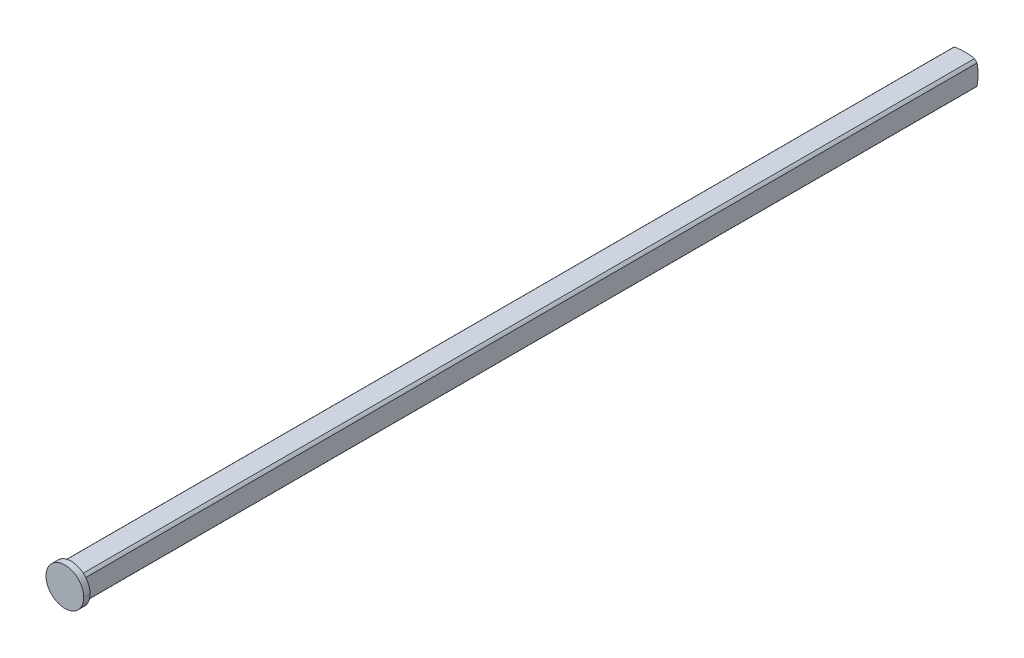
ISO-10303-21;
HEADER;
FILE_DESCRIPTION(('STEP AP214'),'2;1');
FILE_NAME('part.step','',(''),(''),'','','');
FILE_SCHEMA(('AUTOMOTIVE_DESIGN { 1 0 10303 214 1 1 1 1 }'));
ENDSEC;
DATA;
#1=APPLICATION_CONTEXT('core data for automotive mechanical design processes');
#2=APPLICATION_PROTOCOL_DEFINITION('international standard','automotive_design',2000,#1);
#3=PRODUCT_CONTEXT('',#1,'mechanical');
#4=PRODUCT('Part','Part','',(#3));
#5=PRODUCT_RELATED_PRODUCT_CATEGORY('part','',(#4));
#6=PRODUCT_DEFINITION_FORMATION('','',#4);
#7=PRODUCT_DEFINITION_CONTEXT('part definition',#1,'design');
#8=PRODUCT_DEFINITION('design','',#6,#7);
#9=PRODUCT_DEFINITION_SHAPE('','',#8);
#10=(LENGTH_UNIT() NAMED_UNIT(*) SI_UNIT(.MILLI.,.METRE.));
#11=(NAMED_UNIT(*) PLANE_ANGLE_UNIT() SI_UNIT($,.RADIAN.));
#12=(NAMED_UNIT(*) SI_UNIT($,.STERADIAN.) SOLID_ANGLE_UNIT());
#13=UNCERTAINTY_MEASURE_WITH_UNIT(LENGTH_MEASURE(1.E-05),#10,'distance_accuracy_value','');
#14=(GEOMETRIC_REPRESENTATION_CONTEXT(3) GLOBAL_UNCERTAINTY_ASSIGNED_CONTEXT((#13)) GLOBAL_UNIT_ASSIGNED_CONTEXT((#10,
#11,#12)) REPRESENTATION_CONTEXT('',''));
#15=CARTESIAN_POINT('',(0.,0.,0.));
#16=DIRECTION('',(0.,0.,1.));
#17=DIRECTION('',(1.,0.,0.));
#18=AXIS2_PLACEMENT_3D('',#15,#16,#17);
#19=CARTESIAN_POINT('',(0.,0.,-112.522));
#20=DIRECTION('',(0.,0.,1.));
#21=DIRECTION('',(1.,0.,0.));
#22=AXIS2_PLACEMENT_3D('',#19,#20,#21);
#23=CYLINDRICAL_SURFACE('',#22,2.032);
#24=DIRECTION('',(0.,0.,-1.));
#25=VECTOR('',#24,1.);
#26=CARTESIAN_POINT('',(1.5875,1.26841150657032,-112.522));
#27=LINE('',#26,#25);
#28=CARTESIAN_POINT('',(1.5875,1.26841150657032,0.));
#29=VERTEX_POINT('',#28);
#30=CARTESIAN_POINT('',(1.5875,1.26841150657032,-112.370919142098));
#31=VERTEX_POINT('',#30);
#32=EDGE_CURVE('P0_E174',#29,#31,#27,.T.);
#33=ORIENTED_EDGE('',*,*,#32,.T.);
#34=CARTESIAN_POINT('',(0.,0.,-112.370919142098));
#35=DIRECTION('',(0.,0.,1.));
#36=DIRECTION('',(1.,0.,0.));
#37=AXIS2_PLACEMENT_3D('',#34,#35,#36);
#38=CIRCLE('',#37,2.032);
#39=CARTESIAN_POINT('',(1.26841150657032,1.5875,-112.370919142098));
#40=VERTEX_POINT('',#39);
#41=EDGE_CURVE('P0_E294',#31,#40,#38,.T.);
#42=ORIENTED_EDGE('',*,*,#41,.T.);
#43=DIRECTION('',(0.,0.,1.));
#44=VECTOR('',#43,1.);
#45=CARTESIAN_POINT('',(1.26841150657032,1.5875,-112.522));
#46=LINE('',#45,#44);
#47=CARTESIAN_POINT('',(1.26841150657032,1.5875,0.));
#48=VERTEX_POINT('',#47);
#49=EDGE_CURVE('P0_E172',#40,#48,#46,.T.);
#50=ORIENTED_EDGE('',*,*,#49,.T.);
#51=CARTESIAN_POINT('',(0.,0.,0.));
#52=DIRECTION('',(0.,0.,1.));
#53=DIRECTION('',(1.,0.,0.));
#54=AXIS2_PLACEMENT_3D('',#51,#52,#53);
#55=CIRCLE('',#54,2.032);
#56=EDGE_CURVE('P0_E124',#29,#48,#55,.T.);
#57=ORIENTED_EDGE('',*,*,#56,.F.);
#58=EDGE_LOOP('',(#33,#42,#50,#57));
#59=FACE_BOUND('',#58,.T.);
#60=ADVANCED_FACE('P0_F17',(#59),#23,.T.);
#61=CARTESIAN_POINT('',(0.,0.,-112.522));
#62=DIRECTION('',(0.,0.,1.));
#63=DIRECTION('',(1.,0.,0.));
#64=AXIS2_PLACEMENT_3D('',#61,#62,#63);
#65=CYLINDRICAL_SURFACE('',#64,2.032);
#66=DIRECTION('',(0.,0.,1.));
#67=VECTOR('',#66,1.);
#68=CARTESIAN_POINT('',(-1.5875,1.26841150657032,-112.522));
#69=LINE('',#68,#67);
#70=CARTESIAN_POINT('',(-1.5875,1.26841150657032,-112.370919142098));
#71=VERTEX_POINT('',#70);
#72=CARTESIAN_POINT('',(-1.5875,1.26841150657032,0.));
#73=VERTEX_POINT('',#72);
#74=EDGE_CURVE('P0_E277',#71,#73,#69,.T.);
#75=ORIENTED_EDGE('',*,*,#74,.T.);
#76=CARTESIAN_POINT('',(0.,0.,0.));
#77=DIRECTION('',(0.,0.,1.));
#78=DIRECTION('',(1.,0.,0.));
#79=AXIS2_PLACEMENT_3D('',#76,#77,#78);
#80=CIRCLE('',#79,2.032);
#81=CARTESIAN_POINT('',(-1.26841150657032,1.5875,0.));
#82=VERTEX_POINT('',#81);
#83=EDGE_CURVE('P0_E42',#82,#73,#80,.T.);
#84=ORIENTED_EDGE('',*,*,#83,.F.);
#85=DIRECTION('',(0.,0.,-1.));
#86=VECTOR('',#85,1.);
#87=CARTESIAN_POINT('',(-1.26841150657032,1.5875,-112.522));
#88=LINE('',#87,#86);
#89=CARTESIAN_POINT('',(-1.26841150657032,1.5875,-112.370919142098));
#90=VERTEX_POINT('',#89);
#91=EDGE_CURVE('P0_E157',#82,#90,#88,.T.);
#92=ORIENTED_EDGE('',*,*,#91,.T.);
#93=CARTESIAN_POINT('',(0.,0.,-112.370919142098));
#94=DIRECTION('',(0.,0.,1.));
#95=DIRECTION('',(1.,0.,0.));
#96=AXIS2_PLACEMENT_3D('',#93,#94,#95);
#97=CIRCLE('',#96,2.032);
#98=EDGE_CURVE('P0_E258',#90,#71,#97,.T.);
#99=ORIENTED_EDGE('',*,*,#98,.T.);
#100=EDGE_LOOP('',(#75,#84,#92,#99));
#101=FACE_BOUND('',#100,.T.);
#102=ADVANCED_FACE('P0_F197',(#101),#65,.T.);
#103=CARTESIAN_POINT('',(0.,0.,-112.522));
#104=DIRECTION('',(0.,0.,1.));
#105=DIRECTION('',(1.,0.,0.));
#106=AXIS2_PLACEMENT_3D('',#103,#104,#105);
#107=CYLINDRICAL_SURFACE('',#106,2.032);
#108=DIRECTION('',(0.,0.,-1.));
#109=VECTOR('',#108,1.);
#110=CARTESIAN_POINT('',(-1.5875,-1.26841150657032,-112.522));
#111=LINE('',#110,#109);
#112=CARTESIAN_POINT('',(-1.5875,-1.26841150657032,0.));
#113=VERTEX_POINT('',#112);
#114=CARTESIAN_POINT('',(-1.5875,-1.26841150657032,-112.370919142098));
#115=VERTEX_POINT('',#114);
#116=EDGE_CURVE('P0_E290',#113,#115,#111,.T.);
#117=ORIENTED_EDGE('',*,*,#116,.T.);
#118=CARTESIAN_POINT('',(0.,0.,-112.370919142098));
#119=DIRECTION('',(0.,0.,1.));
#120=DIRECTION('',(1.,0.,0.));
#121=AXIS2_PLACEMENT_3D('',#118,#119,#120);
#122=CIRCLE('',#121,2.032);
#123=CARTESIAN_POINT('',(-1.26841150657032,-1.5875,-112.370919142098));
#124=VERTEX_POINT('',#123);
#125=EDGE_CURVE('P0_E11',#115,#124,#122,.T.);
#126=ORIENTED_EDGE('',*,*,#125,.T.);
#127=DIRECTION('',(0.,0.,1.));
#128=VECTOR('',#127,1.);
#129=CARTESIAN_POINT('',(-1.26841150657032,-1.5875,-112.522));
#130=LINE('',#129,#128);
#131=CARTESIAN_POINT('',(-1.26841150657032,-1.5875,0.));
#132=VERTEX_POINT('',#131);
#133=EDGE_CURVE('P0_E399',#124,#132,#130,.T.);
#134=ORIENTED_EDGE('',*,*,#133,.T.);
#135=CARTESIAN_POINT('',(0.,0.,0.));
#136=DIRECTION('',(0.,0.,1.));
#137=DIRECTION('',(1.,0.,0.));
#138=AXIS2_PLACEMENT_3D('',#135,#136,#137);
#139=CIRCLE('',#138,2.032);
#140=EDGE_CURVE('P0_E147',#113,#132,#139,.T.);
#141=ORIENTED_EDGE('',*,*,#140,.F.);
#142=EDGE_LOOP('',(#117,#126,#134,#141));
#143=FACE_BOUND('',#142,.T.);
#144=ADVANCED_FACE('P0_F325',(#143),#107,.T.);
#145=CARTESIAN_POINT('',(0.,0.,-112.522));
#146=DIRECTION('',(0.,0.,1.));
#147=DIRECTION('',(1.,0.,0.));
#148=AXIS2_PLACEMENT_3D('',#145,#146,#147);
#149=CYLINDRICAL_SURFACE('',#148,2.032);
#150=DIRECTION('',(0.,0.,-1.));
#151=VECTOR('',#150,1.);
#152=CARTESIAN_POINT('',(1.26841150657032,-1.5875,-112.522));
#153=LINE('',#152,#151);
#154=CARTESIAN_POINT('',(1.26841150657032,-1.5875,0.));
#155=VERTEX_POINT('',#154);
#156=CARTESIAN_POINT('',(1.26841150657032,-1.5875,-112.370919142098));
#157=VERTEX_POINT('',#156);
#158=EDGE_CURVE('P0_E164',#155,#157,#153,.T.);
#159=ORIENTED_EDGE('',*,*,#158,.T.);
#160=CARTESIAN_POINT('',(0.,0.,-112.370919142098));
#161=DIRECTION('',(0.,0.,1.));
#162=DIRECTION('',(1.,0.,0.));
#163=AXIS2_PLACEMENT_3D('',#160,#161,#162);
#164=CIRCLE('',#163,2.032);
#165=CARTESIAN_POINT('',(1.5875,-1.26841150657032,-112.370919142098));
#166=VERTEX_POINT('',#165);
#167=EDGE_CURVE('P0_E26',#157,#166,#164,.T.);
#168=ORIENTED_EDGE('',*,*,#167,.T.);
#169=DIRECTION('',(0.,0.,1.));
#170=VECTOR('',#169,1.);
#171=CARTESIAN_POINT('',(1.5875,-1.26841150657032,-112.522));
#172=LINE('',#171,#170);
#173=CARTESIAN_POINT('',(1.5875,-1.26841150657032,0.));
#174=VERTEX_POINT('',#173);
#175=EDGE_CURVE('P0_E163',#166,#174,#172,.T.);
#176=ORIENTED_EDGE('',*,*,#175,.T.);
#177=CARTESIAN_POINT('',(0.,0.,0.));
#178=DIRECTION('',(0.,0.,1.));
#179=DIRECTION('',(1.,0.,0.));
#180=AXIS2_PLACEMENT_3D('',#177,#178,#179);
#181=CIRCLE('',#180,2.032);
#182=EDGE_CURVE('P0_E153',#155,#174,#181,.T.);
#183=ORIENTED_EDGE('',*,*,#182,.F.);
#184=EDGE_LOOP('',(#159,#168,#176,#183));
#185=FACE_BOUND('',#184,.T.);
#186=ADVANCED_FACE('P0_F322',(#185),#149,.T.);
#187=CARTESIAN_POINT('',(-1.5875,1.5875,-112.522));
#188=DIRECTION('',(0.,0.,-1.));
#189=DIRECTION('',(0.,-1.,0.));
#190=AXIS2_PLACEMENT_3D('',#187,#188,#189);
#191=PLANE('',#190);
#192=CARTESIAN_POINT('',(0.,0.,-112.522));
#193=DIRECTION('',(0.,0.,1.));
#194=DIRECTION('',(1.,0.,0.));
#195=AXIS2_PLACEMENT_3D('',#192,#193,#194);
#196=CIRCLE('',#195,1.24506403026729);
#197=CARTESIAN_POINT('',(1.24506403026729,0.,-112.522));
#198=VERTEX_POINT('',#197);
#199=CARTESIAN_POINT('',(-1.24506403026729,0.,-112.522));
#200=VERTEX_POINT('',#199);
#201=EDGE_CURVE('P0_E120',#198,#200,#196,.T.);
#202=ORIENTED_EDGE('',*,*,#201,.F.);
#203=CARTESIAN_POINT('',(0.,0.,-112.522));
#204=DIRECTION('',(0.,0.,1.));
#205=DIRECTION('',(1.,0.,0.));
#206=AXIS2_PLACEMENT_3D('',#203,#204,#205);
#207=CIRCLE('',#206,1.24506403026729);
#208=EDGE_CURVE('P0_E116',#200,#198,#207,.T.);
#209=ORIENTED_EDGE('',*,*,#208,.F.);
#210=EDGE_LOOP('',(#202,#209));
#211=FACE_BOUND('',#210,.T.);
#212=ADVANCED_FACE('P0_F119',(#211),#191,.T.);
#213=CARTESIAN_POINT('',(0.,0.,-110.397));
#214=DIRECTION('',(0.,0.,1.));
#215=DIRECTION('',(1.,0.,0.));
#216=AXIS2_PLACEMENT_3D('',#213,#214,#215);
#217=DEGENERATE_TOROIDAL_SURFACE('',#216,1.24506403026729,2.125,.T.);
#218=CARTESIAN_POINT('',(-1.24506403026729,0.,-110.397));
#219=DIRECTION('',(0.,1.,0.));
#220=DIRECTION('',(-1.,0.,0.));
#221=AXIS2_PLACEMENT_3D('',#218,#219,#220);
#222=CIRCLE('',#221,2.125);
#223=CARTESIAN_POINT('',(-1.5875,0.,-112.494227361693));
#224=VERTEX_POINT('',#223);
#225=EDGE_CURVE('P0_E128',#200,#224,#222,.T.);
#226=ORIENTED_EDGE('',*,*,#225,.F.);
#227=ORIENTED_EDGE('',*,*,#208,.T.);
#228=CARTESIAN_POINT('',(1.24506403026729,0.,-110.397));
#229=DIRECTION('',(0.,-1.,0.));
#230=DIRECTION('',(0.,0.,-1.));
#231=AXIS2_PLACEMENT_3D('',#228,#229,#230);
#232=CIRCLE('',#231,2.125);
#233=CARTESIAN_POINT('',(1.5875,0.,-112.494227361693));
#234=VERTEX_POINT('',#233);
#235=EDGE_CURVE('P0_E142',#198,#234,#232,.T.);
#236=ORIENTED_EDGE('',*,*,#235,.T.);
#237=CARTESIAN_POINT('',(1.5875,-1.26841150657032,-112.370919142098));
#238=CARTESIAN_POINT('',(1.5875,-0.98707709495555,-112.440930639124));
#239=CARTESIAN_POINT('',(1.5875,-0.639530459017568,-112.47018195389));
#240=CARTESIAN_POINT('',(1.5875,-0.353837297572158,-112.494227361693));
#241=CARTESIAN_POINT('',(1.5875,0.,-112.494227361693));
#242=B_SPLINE_CURVE_WITH_KNOTS('',2,(#237,#238,#239,#240,#241),.UNSPECIFIED.,.F.,.F.,(3,2,3),
(0.,0.5,1.),.UNSPECIFIED.);
#243=EDGE_CURVE('P0_E177',#166,#234,#242,.T.);
#244=ORIENTED_EDGE('',*,*,#243,.F.);
#245=ORIENTED_EDGE('',*,*,#167,.F.);
#246=CARTESIAN_POINT('',(-1.26841150657032,-1.5875,-112.370919142098));
#247=CARTESIAN_POINT('',(-0.770338232285919,-1.5875,-112.494867205761));
#248=CARTESIAN_POINT('',(0.00849337593367507,-1.5875,-112.49422365179));
#249=CARTESIAN_POINT('',(0.775470990323975,-1.5875,-112.493589892857));
#250=CARTESIAN_POINT('',(1.26841150657033,-1.5875,-112.370919142098));
#251=B_SPLINE_CURVE_WITH_KNOTS('',2,(#246,#247,#248,#249,#250),.UNSPECIFIED.,.F.,.F.,(3,2,3),
(0.,0.5,1.),.UNSPECIFIED.);
#252=EDGE_CURVE('P0_E306',#124,#157,#251,.T.);
#253=ORIENTED_EDGE('',*,*,#252,.F.);
#254=ORIENTED_EDGE('',*,*,#125,.F.);
#255=CARTESIAN_POINT('',(-1.5875,0.,-112.494227361693));
#256=CARTESIAN_POINT('',(-1.5875,-0.35317995732653,-112.494227361693));
#257=CARTESIAN_POINT('',(-1.5875,-0.639529322286498,-112.470182049451));
#258=CARTESIAN_POINT('',(-1.5875,-0.986669843199056,-112.441031985792));
#259=CARTESIAN_POINT('',(-1.5875,-1.26841150657032,-112.370919142098));
#260=B_SPLINE_CURVE_WITH_KNOTS('',2,(#255,#256,#257,#258,#259),.UNSPECIFIED.,.F.,.F.,(3,2,3),
(0.,0.5,1.),.UNSPECIFIED.);
#261=EDGE_CURVE('P0_E135',#224,#115,#260,.T.);
#262=ORIENTED_EDGE('',*,*,#261,.F.);
#263=EDGE_LOOP('',(#226,#227,#236,#244,#245,#253,#254,#262));
#264=FACE_BOUND('',#263,.T.);
#265=ADVANCED_FACE('P0_F127',(#264),#217,.T.);
#266=CARTESIAN_POINT('',(-1.5875,1.5875,0.));
#267=DIRECTION('',(0.,0.,-1.));
#268=DIRECTION('',(0.,-1.,0.));
#269=AXIS2_PLACEMENT_3D('',#266,#267,#268);
#270=PLANE('',#269);
#271=ORIENTED_EDGE('',*,*,#83,.T.);
#272=DIRECTION('',(0.,-1.,0.));
#273=VECTOR('',#272,1.);
#274=CARTESIAN_POINT('',(-1.5875,-1.5875,0.));
#275=LINE('',#274,#273);
#276=EDGE_CURVE('P0_E404',#73,#113,#275,.T.);
#277=ORIENTED_EDGE('',*,*,#276,.T.);
#278=ORIENTED_EDGE('',*,*,#140,.T.);
#279=DIRECTION('',(1.,0.,0.));
#280=VECTOR('',#279,1.);
#281=CARTESIAN_POINT('',(-1.5875,-1.5875,0.));
#282=LINE('',#281,#280);
#283=EDGE_CURVE('P0_E159',#132,#155,#282,.T.);
#284=ORIENTED_EDGE('',*,*,#283,.T.);
#285=ORIENTED_EDGE('',*,*,#182,.T.);
#286=DIRECTION('',(0.,1.,0.));
#287=VECTOR('',#286,1.);
#288=CARTESIAN_POINT('',(1.5875,-1.5875,0.));
#289=LINE('',#288,#287);
#290=EDGE_CURVE('P0_E169',#174,#29,#289,.T.);
#291=ORIENTED_EDGE('',*,*,#290,.T.);
#292=ORIENTED_EDGE('',*,*,#56,.T.);
#293=DIRECTION('',(-1.,0.,0.));
#294=VECTOR('',#293,1.);
#295=CARTESIAN_POINT('',(-1.5875,1.5875,0.));
#296=LINE('',#295,#294);
#297=EDGE_CURVE('P0_E156',#48,#82,#296,.T.);
#298=ORIENTED_EDGE('',*,*,#297,.T.);
#299=EDGE_LOOP('',(#271,#277,#278,#284,#285,#291,#292,#298));
#300=FACE_BOUND('',#299,.T.);
#301=ADVANCED_FACE('P0_F228',(#300),#270,.F.);
#302=CARTESIAN_POINT('',(-1.5875,1.5875,0.));
#303=DIRECTION('',(0.,-1.,0.));
#304=DIRECTION('',(0.,0.,-1.));
#305=AXIS2_PLACEMENT_3D('',#302,#303,#304);
#306=PLANE('',#305);
#307=ORIENTED_EDGE('',*,*,#49,.F.);
#308=CARTESIAN_POINT('',(1.26841150657033,1.5875,-112.370919142098));
#309=CARTESIAN_POINT('',(0.77033823228592,1.5875,-112.494867205761));
#310=CARTESIAN_POINT('',(-0.00849337593367486,1.5875,-112.49422365179));
#311=CARTESIAN_POINT('',(-0.775470990323975,1.5875,-112.493589892857));
#312=CARTESIAN_POINT('',(-1.26841150657032,1.5875,-112.370919142098));
#313=B_SPLINE_CURVE_WITH_KNOTS('',2,(#308,#309,#310,#311,#312),.UNSPECIFIED.,.F.,.F.,(3,2,3),
(0.,0.5,1.),.UNSPECIFIED.);
#314=EDGE_CURVE('P0_E257',#40,#90,#313,.T.);
#315=ORIENTED_EDGE('',*,*,#314,.T.);
#316=ORIENTED_EDGE('',*,*,#91,.F.);
#317=ORIENTED_EDGE('',*,*,#297,.F.);
#318=EDGE_LOOP('',(#307,#315,#316,#317));
#319=FACE_BOUND('',#318,.T.);
#320=ADVANCED_FACE('P0_F198',(#319),#306,.F.);
#321=CARTESIAN_POINT('',(1.5875,-1.5875,0.));
#322=DIRECTION('',(-1.,0.,0.));
#323=DIRECTION('',(0.,0.,1.));
#324=AXIS2_PLACEMENT_3D('',#321,#322,#323);
#325=PLANE('',#324);
#326=ORIENTED_EDGE('',*,*,#175,.F.);
#327=ORIENTED_EDGE('',*,*,#243,.T.);
#328=CARTESIAN_POINT('',(1.5875,0.,-112.494227361693));
#329=CARTESIAN_POINT('',(1.5875,0.353179957326585,-112.494227361693));
#330=CARTESIAN_POINT('',(1.5875,0.6395293222865,-112.470182049451));
#331=CARTESIAN_POINT('',(1.5875,0.98666984319909,-112.441031985792));
#332=CARTESIAN_POINT('',(1.5875,1.26841150657033,-112.370919142098));
#333=B_SPLINE_CURVE_WITH_KNOTS('',2,(#328,#329,#330,#331,#332),.UNSPECIFIED.,.F.,.F.,(3,2,3),
(0.,0.5,1.),.UNSPECIFIED.);
#334=EDGE_CURVE('P0_E212',#234,#31,#333,.T.);
#335=ORIENTED_EDGE('',*,*,#334,.T.);
#336=ORIENTED_EDGE('',*,*,#32,.F.);
#337=ORIENTED_EDGE('',*,*,#290,.F.);
#338=EDGE_LOOP('',(#326,#327,#335,#336,#337));
#339=FACE_BOUND('',#338,.T.);
#340=ADVANCED_FACE('P0_F184',(#339),#325,.F.);
#341=CARTESIAN_POINT('',(-1.5875,-1.5875,0.));
#342=DIRECTION('',(0.,1.,0.));
#343=DIRECTION('',(1.,0.,0.));
#344=AXIS2_PLACEMENT_3D('',#341,#342,#343);
#345=PLANE('',#344);
#346=ORIENTED_EDGE('',*,*,#133,.F.);
#347=ORIENTED_EDGE('',*,*,#252,.T.);
#348=ORIENTED_EDGE('',*,*,#158,.F.);
#349=ORIENTED_EDGE('',*,*,#283,.F.);
#350=EDGE_LOOP('',(#346,#347,#348,#349));
#351=FACE_BOUND('',#350,.T.);
#352=ADVANCED_FACE('P0_F194',(#351),#345,.F.);
#353=CARTESIAN_POINT('',(-1.5875,-1.5875,0.));
#354=DIRECTION('',(1.,0.,0.));
#355=DIRECTION('',(0.,1.,0.));
#356=AXIS2_PLACEMENT_3D('',#353,#354,#355);
#357=PLANE('',#356);
#358=ORIENTED_EDGE('',*,*,#74,.F.);
#359=CARTESIAN_POINT('',(-1.5875,1.26841150657033,-112.370919142098));
#360=CARTESIAN_POINT('',(-1.5875,0.98707709495557,-112.440930639124));
#361=CARTESIAN_POINT('',(-1.5875,0.63953045901757,-112.47018195389));
#362=CARTESIAN_POINT('',(-1.5875,0.353837297572185,-112.494227361693));
#363=CARTESIAN_POINT('',(-1.5875,0.,-112.494227361693));
#364=B_SPLINE_CURVE_WITH_KNOTS('',2,(#359,#360,#361,#362,#363),.UNSPECIFIED.,.F.,.F.,(3,2,3),
(0.,0.5,1.),.UNSPECIFIED.);
#365=EDGE_CURVE('P0_E138',#71,#224,#364,.T.);
#366=ORIENTED_EDGE('',*,*,#365,.T.);
#367=ORIENTED_EDGE('',*,*,#261,.T.);
#368=ORIENTED_EDGE('',*,*,#116,.F.);
#369=ORIENTED_EDGE('',*,*,#276,.F.);
#370=EDGE_LOOP('',(#358,#366,#367,#368,#369));
#371=FACE_BOUND('',#370,.T.);
#372=ADVANCED_FACE('P0_F19',(#371),#357,.F.);
#373=CARTESIAN_POINT('',(0.,0.,-110.397));
#374=DIRECTION('',(0.,0.,1.));
#375=DIRECTION('',(1.,0.,0.));
#376=AXIS2_PLACEMENT_3D('',#373,#374,#375);
#377=DEGENERATE_TOROIDAL_SURFACE('',#376,1.24506403026729,2.125,.T.);
#378=ORIENTED_EDGE('',*,*,#201,.T.);
#379=ORIENTED_EDGE('',*,*,#225,.T.);
#380=ORIENTED_EDGE('',*,*,#365,.F.);
#381=ORIENTED_EDGE('',*,*,#98,.F.);
#382=ORIENTED_EDGE('',*,*,#314,.F.);
#383=ORIENTED_EDGE('',*,*,#41,.F.);
#384=ORIENTED_EDGE('',*,*,#334,.F.);
#385=ORIENTED_EDGE('',*,*,#235,.F.);
#386=EDGE_LOOP('',(#378,#379,#380,#381,#382,#383,#384,#385));
#387=FACE_BOUND('',#386,.T.);
#388=ADVANCED_FACE('P0_F139',(#387),#377,.T.);
#389=CLOSED_SHELL('',(#60,#102,#144,#186,#212,#265,#301,#320,#340,#352,#372,#388));
#390=MANIFOLD_SOLID_BREP('P0_B1',#389);
#391=CARTESIAN_POINT('',(0.,0.,0.));
#392=DIRECTION('',(0.,0.,1.));
#393=DIRECTION('',(1.,0.,0.));
#394=AXIS2_PLACEMENT_3D('',#391,#392,#393);
#395=PLANE('',#394);
#396=CARTESIAN_POINT('',(0.,0.,0.));
#397=DIRECTION('',(0.,0.,1.));
#398=DIRECTION('',(1.,0.,0.));
#399=AXIS2_PLACEMENT_3D('',#396,#397,#398);
#400=CIRCLE('',#399,2.375);
#401=CARTESIAN_POINT('',(-2.375,0.,0.));
#402=VERTEX_POINT('',#401);
#403=CARTESIAN_POINT('',(2.375,0.,0.));
#404=VERTEX_POINT('',#403);
#405=EDGE_CURVE('P1_E10',#402,#404,#400,.T.);
#406=ORIENTED_EDGE('',*,*,#405,.F.);
#407=CARTESIAN_POINT('',(0.,0.,0.));
#408=DIRECTION('',(0.,0.,1.));
#409=DIRECTION('',(1.,0.,0.));
#410=AXIS2_PLACEMENT_3D('',#407,#408,#409);
#411=CIRCLE('',#410,2.375);
#412=EDGE_CURVE('P1_E70',#404,#402,#411,.T.);
#413=ORIENTED_EDGE('',*,*,#412,.F.);
#414=EDGE_LOOP('',(#406,#413));
#415=FACE_BOUND('',#414,.T.);
#416=ADVANCED_FACE('P1_F16',(#415),#395,.F.);
#417=CARTESIAN_POINT('',(0.,0.,0.8));
#418=DIRECTION('',(0.,0.,1.));
#419=DIRECTION('',(1.,0.,0.));
#420=AXIS2_PLACEMENT_3D('',#417,#418,#419);
#421=PLANE('',#420);
#422=CARTESIAN_POINT('',(0.,0.,0.8));
#423=DIRECTION('',(0.,0.,1.));
#424=DIRECTION('',(1.,0.,0.));
#425=AXIS2_PLACEMENT_3D('',#422,#423,#424);
#426=CIRCLE('',#425,2.375);
#427=CARTESIAN_POINT('',(-2.375,0.,0.8));
#428=VERTEX_POINT('',#427);
#429=CARTESIAN_POINT('',(2.375,0.,0.8));
#430=VERTEX_POINT('',#429);
#431=EDGE_CURVE('P1_E25',#428,#430,#426,.T.);
#432=ORIENTED_EDGE('',*,*,#431,.T.);
#433=CARTESIAN_POINT('',(0.,0.,0.8));
#434=DIRECTION('',(0.,0.,1.));
#435=DIRECTION('',(1.,0.,0.));
#436=AXIS2_PLACEMENT_3D('',#433,#434,#435);
#437=CIRCLE('',#436,2.375);
#438=EDGE_CURVE('P1_E60',#430,#428,#437,.T.);
#439=ORIENTED_EDGE('',*,*,#438,.T.);
#440=EDGE_LOOP('',(#432,#439));
#441=FACE_BOUND('',#440,.T.);
#442=ADVANCED_FACE('P1_F54',(#441),#421,.T.);
#443=CARTESIAN_POINT('',(0.,0.,0.8));
#444=DIRECTION('',(0.,0.,-1.));
#445=DIRECTION('',(-1.,0.,0.));
#446=AXIS2_PLACEMENT_3D('',#443,#444,#445);
#447=CYLINDRICAL_SURFACE('',#446,2.375);
#448=DIRECTION('',(0.,0.,-1.));
#449=VECTOR('',#448,1.);
#450=CARTESIAN_POINT('',(2.375,0.,0.8));
#451=LINE('',#450,#449);
#452=EDGE_CURVE('P1_E62',#430,#404,#451,.T.);
#453=ORIENTED_EDGE('',*,*,#452,.F.);
#454=ORIENTED_EDGE('',*,*,#431,.F.);
#455=DIRECTION('',(0.,0.,-1.));
#456=VECTOR('',#455,1.);
#457=CARTESIAN_POINT('',(-2.375,0.,0.8));
#458=LINE('',#457,#456);
#459=EDGE_CURVE('P1_E19',#428,#402,#458,.T.);
#460=ORIENTED_EDGE('',*,*,#459,.T.);
#461=ORIENTED_EDGE('',*,*,#405,.T.);
#462=EDGE_LOOP('',(#453,#454,#460,#461));
#463=FACE_BOUND('',#462,.T.);
#464=ADVANCED_FACE('P1_F64',(#463),#447,.T.);
#465=CARTESIAN_POINT('',(0.,0.,0.8));
#466=DIRECTION('',(0.,0.,-1.));
#467=DIRECTION('',(-1.,0.,0.));
#468=AXIS2_PLACEMENT_3D('',#465,#466,#467);
#469=CYLINDRICAL_SURFACE('',#468,2.375);
#470=ORIENTED_EDGE('',*,*,#438,.F.);
#471=ORIENTED_EDGE('',*,*,#452,.T.);
#472=ORIENTED_EDGE('',*,*,#412,.T.);
#473=ORIENTED_EDGE('',*,*,#459,.F.);
#474=EDGE_LOOP('',(#470,#471,#472,#473));
#475=FACE_BOUND('',#474,.T.);
#476=ADVANCED_FACE('P1_F68',(#475),#469,.T.);
#477=CLOSED_SHELL('',(#416,#442,#464,#476));
#478=MANIFOLD_SOLID_BREP('P1_B1',#477);
#479=ADVANCED_BREP_SHAPE_REPRESENTATION('',(#18,#390,#478),#14);
#480=SHAPE_DEFINITION_REPRESENTATION(#9,#479);
ENDSEC;
END-ISO-10303-21;
